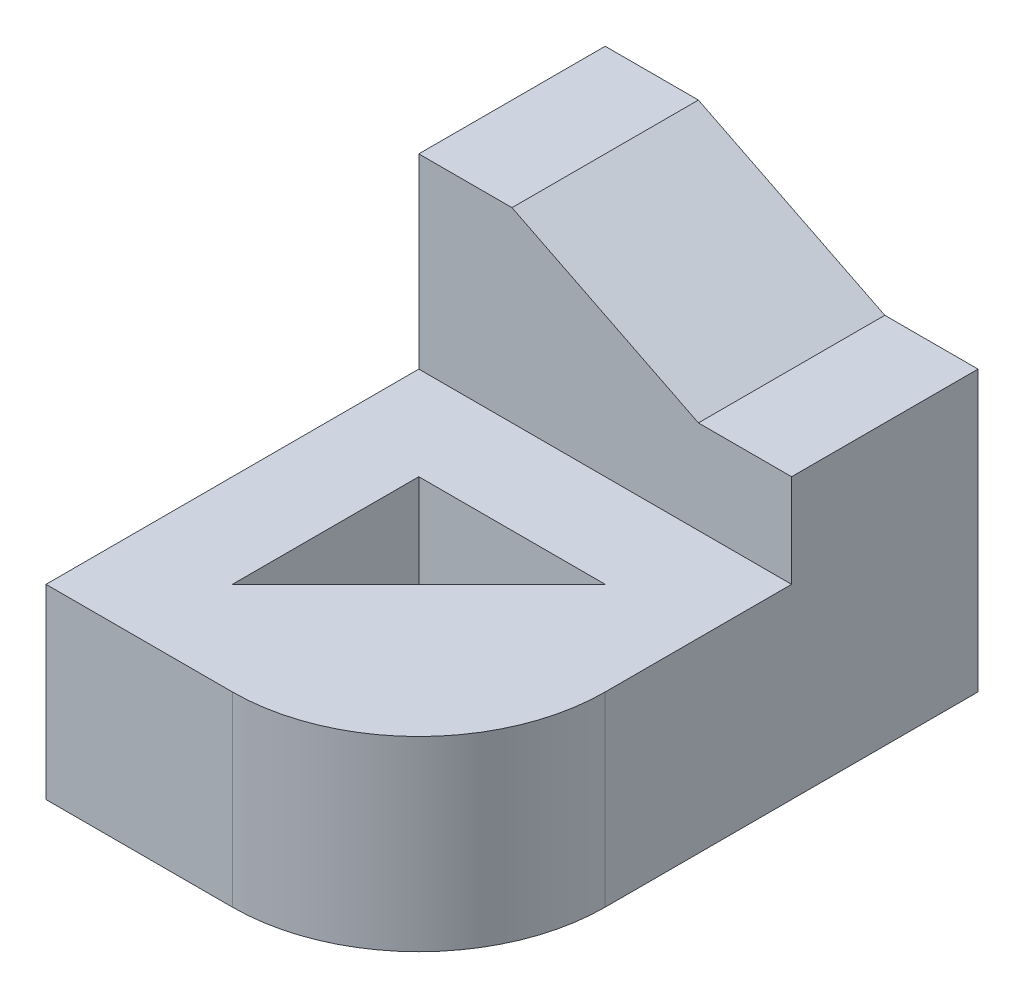
ISO-10303-21;
HEADER;
FILE_DESCRIPTION(('STEP AP214'),'2;1');
FILE_NAME('part.step','',(''),(''),'','','');
FILE_SCHEMA(('AUTOMOTIVE_DESIGN { 1 0 10303 214 1 1 1 1 }'));
ENDSEC;
DATA;
#1=APPLICATION_CONTEXT('core data for automotive mechanical design processes');
#2=APPLICATION_PROTOCOL_DEFINITION('international standard','automotive_design',2000,#1);
#3=PRODUCT_CONTEXT('',#1,'mechanical');
#4=PRODUCT('Part','Part','',(#3));
#5=PRODUCT_RELATED_PRODUCT_CATEGORY('part','',(#4));
#6=PRODUCT_DEFINITION_FORMATION('','',#4);
#7=PRODUCT_DEFINITION_CONTEXT('part definition',#1,'design');
#8=PRODUCT_DEFINITION('design','',#6,#7);
#9=PRODUCT_DEFINITION_SHAPE('','',#8);
#10=(LENGTH_UNIT() NAMED_UNIT(*) SI_UNIT(.MILLI.,.METRE.));
#11=(NAMED_UNIT(*) PLANE_ANGLE_UNIT() SI_UNIT($,.RADIAN.));
#12=(NAMED_UNIT(*) SI_UNIT($,.STERADIAN.) SOLID_ANGLE_UNIT());
#13=UNCERTAINTY_MEASURE_WITH_UNIT(LENGTH_MEASURE(1.E-05),#10,'distance_accuracy_value','');
#14=(GEOMETRIC_REPRESENTATION_CONTEXT(3) GLOBAL_UNCERTAINTY_ASSIGNED_CONTEXT((#13)) GLOBAL_UNIT_ASSIGNED_CONTEXT((#10,
#11,#12)) REPRESENTATION_CONTEXT('',''));
#15=CARTESIAN_POINT('',(0.,0.,0.));
#16=DIRECTION('',(0.,0.,1.));
#17=DIRECTION('',(1.,0.,0.));
#18=AXIS2_PLACEMENT_3D('',#15,#16,#17);
#19=CARTESIAN_POINT('',(0.,10.,0.));
#20=DIRECTION('',(1.,0.,0.));
#21=DIRECTION('',(0.,0.,-1.));
#22=AXIS2_PLACEMENT_3D('',#19,#20,#21);
#23=PLANE('',#22);
#24=DIRECTION('',(0.,0.,1.));
#25=VECTOR('',#24,1.);
#26=CARTESIAN_POINT('',(0.,0.,0.));
#27=LINE('',#26,#25);
#28=CARTESIAN_POINT('',(0.,0.,-30.));
#29=VERTEX_POINT('',#28);
#30=CARTESIAN_POINT('',(0.,0.,0.));
#31=VERTEX_POINT('',#30);
#32=EDGE_CURVE('E185',#29,#31,#27,.T.);
#33=ORIENTED_EDGE('',*,*,#32,.T.);
#34=DIRECTION('',(0.,-1.,0.));
#35=VECTOR('',#34,1.);
#36=CARTESIAN_POINT('',(0.,10.,0.));
#37=LINE('',#36,#35);
#38=CARTESIAN_POINT('',(0.,10.,0.));
#39=VERTEX_POINT('',#38);
#40=EDGE_CURVE('E209',#39,#31,#37,.T.);
#41=ORIENTED_EDGE('',*,*,#40,.F.);
#42=DIRECTION('',(0.,0.,1.));
#43=VECTOR('',#42,1.);
#44=CARTESIAN_POINT('',(0.,10.,0.));
#45=LINE('',#44,#43);
#46=CARTESIAN_POINT('',(0.,10.,-20.));
#47=VERTEX_POINT('',#46);
#48=EDGE_CURVE('E142',#47,#39,#45,.T.);
#49=ORIENTED_EDGE('',*,*,#48,.F.);
#50=DIRECTION('',(0.,1.,0.));
#51=VECTOR('',#50,1.);
#52=CARTESIAN_POINT('',(0.,10.,-20.));
#53=LINE('',#52,#51);
#54=CARTESIAN_POINT('',(0.,20.,-20.));
#55=VERTEX_POINT('',#54);
#56=EDGE_CURVE('E48',#47,#55,#53,.T.);
#57=ORIENTED_EDGE('',*,*,#56,.T.);
#58=DIRECTION('',(0.,0.,-1.));
#59=VECTOR('',#58,1.);
#60=CARTESIAN_POINT('',(0.,20.,-20.));
#61=LINE('',#60,#59);
#62=CARTESIAN_POINT('',(0.,20.,-30.));
#63=VERTEX_POINT('',#62);
#64=EDGE_CURVE('E123',#55,#63,#61,.T.);
#65=ORIENTED_EDGE('',*,*,#64,.T.);
#66=DIRECTION('',(0.,-1.,0.));
#67=VECTOR('',#66,1.);
#68=CARTESIAN_POINT('',(0.,10.,-30.));
#69=LINE('',#68,#67);
#70=EDGE_CURVE('E197',#63,#29,#69,.T.);
#71=ORIENTED_EDGE('',*,*,#70,.T.);
#72=EDGE_LOOP('',(#33,#41,#49,#57,#65,#71));
#73=FACE_BOUND('',#72,.T.);
#74=ADVANCED_FACE('F33',(#73),#23,.F.);
#75=CARTESIAN_POINT('',(0.,10.,0.));
#76=DIRECTION('',(0.,0.,-1.));
#77=DIRECTION('',(-1.,0.,0.));
#78=AXIS2_PLACEMENT_3D('',#75,#76,#77);
#79=PLANE('',#78);
#80=DIRECTION('',(1.,0.,0.));
#81=VECTOR('',#80,1.);
#82=CARTESIAN_POINT('',(0.,0.,0.));
#83=LINE('',#82,#81);
#84=CARTESIAN_POINT('',(10.,0.,0.));
#85=VERTEX_POINT('',#84);
#86=EDGE_CURVE('E199',#31,#85,#83,.T.);
#87=ORIENTED_EDGE('',*,*,#86,.T.);
#88=DIRECTION('',(0.,-1.,0.));
#89=VECTOR('',#88,1.);
#90=CARTESIAN_POINT('',(10.,10.,0.));
#91=LINE('',#90,#89);
#92=CARTESIAN_POINT('',(10.,10.,0.));
#93=VERTEX_POINT('',#92);
#94=EDGE_CURVE('E41',#85,#93,#91,.F.);
#95=ORIENTED_EDGE('',*,*,#94,.T.);
#96=DIRECTION('',(1.,0.,0.));
#97=VECTOR('',#96,1.);
#98=CARTESIAN_POINT('',(0.,10.,0.));
#99=LINE('',#98,#97);
#100=EDGE_CURVE('E190',#39,#93,#99,.T.);
#101=ORIENTED_EDGE('',*,*,#100,.F.);
#102=ORIENTED_EDGE('',*,*,#40,.T.);
#103=EDGE_LOOP('',(#87,#95,#101,#102));
#104=FACE_BOUND('',#103,.T.);
#105=ADVANCED_FACE('F219',(#104),#79,.F.);
#106=CARTESIAN_POINT('',(20.,10.,0.));
#107=DIRECTION('',(-1.,0.,0.));
#108=DIRECTION('',(0.,0.,1.));
#109=AXIS2_PLACEMENT_3D('',#106,#107,#108);
#110=PLANE('',#109);
#111=DIRECTION('',(0.,0.,-1.));
#112=VECTOR('',#111,1.);
#113=CARTESIAN_POINT('',(20.,10.,0.));
#114=LINE('',#113,#112);
#115=CARTESIAN_POINT('',(20.,10.,-10.));
#116=VERTEX_POINT('',#115);
#117=CARTESIAN_POINT('',(20.,10.,-20.));
#118=VERTEX_POINT('',#117);
#119=EDGE_CURVE('E194',#116,#118,#114,.T.);
#120=ORIENTED_EDGE('',*,*,#119,.F.);
#121=DIRECTION('',(0.,-1.,0.));
#122=VECTOR('',#121,1.);
#123=CARTESIAN_POINT('',(20.,10.,-10.));
#124=LINE('',#123,#122);
#125=CARTESIAN_POINT('',(20.,0.,-10.));
#126=VERTEX_POINT('',#125);
#127=EDGE_CURVE('E212',#116,#126,#124,.T.);
#128=ORIENTED_EDGE('',*,*,#127,.T.);
#129=DIRECTION('',(0.,0.,-1.));
#130=VECTOR('',#129,1.);
#131=CARTESIAN_POINT('',(20.,0.,0.));
#132=LINE('',#131,#130);
#133=CARTESIAN_POINT('',(20.,0.,-30.));
#134=VERTEX_POINT('',#133);
#135=EDGE_CURVE('E202',#126,#134,#132,.T.);
#136=ORIENTED_EDGE('',*,*,#135,.T.);
#137=DIRECTION('',(0.,-1.,0.));
#138=VECTOR('',#137,1.);
#139=CARTESIAN_POINT('',(20.,10.,-30.));
#140=LINE('',#139,#138);
#141=CARTESIAN_POINT('',(20.,15.,-30.));
#142=VERTEX_POINT('',#141);
#143=EDGE_CURVE('E206',#142,#134,#140,.T.);
#144=ORIENTED_EDGE('',*,*,#143,.F.);
#145=DIRECTION('',(0.,0.,-1.));
#146=VECTOR('',#145,1.);
#147=CARTESIAN_POINT('',(20.,15.,-20.));
#148=LINE('',#147,#146);
#149=CARTESIAN_POINT('',(20.,15.,-20.));
#150=VERTEX_POINT('',#149);
#151=EDGE_CURVE('E160',#150,#142,#148,.T.);
#152=ORIENTED_EDGE('',*,*,#151,.F.);
#153=DIRECTION('',(0.,-1.,0.));
#154=VECTOR('',#153,1.);
#155=CARTESIAN_POINT('',(20.,15.,-20.));
#156=LINE('',#155,#154);
#157=EDGE_CURVE('E131',#150,#118,#156,.T.);
#158=ORIENTED_EDGE('',*,*,#157,.T.);
#159=EDGE_LOOP('',(#120,#128,#136,#144,#152,#158));
#160=FACE_BOUND('',#159,.T.);
#161=ADVANCED_FACE('F228',(#160),#110,.F.);
#162=CARTESIAN_POINT('',(0.,10.,-30.));
#163=DIRECTION('',(0.,0.,1.));
#164=DIRECTION('',(1.,0.,0.));
#165=AXIS2_PLACEMENT_3D('',#162,#163,#164);
#166=PLANE('',#165);
#167=DIRECTION('',(-1.,0.,0.));
#168=VECTOR('',#167,1.);
#169=CARTESIAN_POINT('',(0.,0.,-30.));
#170=LINE('',#169,#168);
#171=EDGE_CURVE('E191',#134,#29,#170,.T.);
#172=ORIENTED_EDGE('',*,*,#171,.T.);
#173=ORIENTED_EDGE('',*,*,#70,.F.);
#174=DIRECTION('',(1.,0.,0.));
#175=VECTOR('',#174,1.);
#176=CARTESIAN_POINT('',(0.,20.,-30.));
#177=LINE('',#176,#175);
#178=CARTESIAN_POINT('',(5.,20.,-30.));
#179=VERTEX_POINT('',#178);
#180=EDGE_CURVE('E127',#63,#179,#177,.T.);
#181=ORIENTED_EDGE('',*,*,#180,.T.);
#182=DIRECTION('',(0.894427190999916,-0.447213595499958,0.));
#183=VECTOR('',#182,1.);
#184=CARTESIAN_POINT('',(5.,20.,-30.));
#185=LINE('',#184,#183);
#186=CARTESIAN_POINT('',(15.,15.,-30.));
#187=VERTEX_POINT('',#186);
#188=EDGE_CURVE('E155',#179,#187,#185,.T.);
#189=ORIENTED_EDGE('',*,*,#188,.T.);
#190=DIRECTION('',(1.,0.,0.));
#191=VECTOR('',#190,1.);
#192=CARTESIAN_POINT('',(15.,15.,-30.));
#193=LINE('',#192,#191);
#194=EDGE_CURVE('E145',#187,#142,#193,.T.);
#195=ORIENTED_EDGE('',*,*,#194,.T.);
#196=ORIENTED_EDGE('',*,*,#143,.T.);
#197=EDGE_LOOP('',(#172,#173,#181,#189,#195,#196));
#198=FACE_BOUND('',#197,.T.);
#199=ADVANCED_FACE('F234',(#198),#166,.F.);
#200=CARTESIAN_POINT('',(0.,10.,0.));
#201=DIRECTION('',(0.,-1.,0.));
#202=DIRECTION('',(0.,0.,-1.));
#203=AXIS2_PLACEMENT_3D('',#200,#201,#202);
#204=PLANE('',#203);
#205=DIRECTION('',(0.707106781186548,0.,-0.707106781186547));
#206=VECTOR('',#205,1.);
#207=CARTESIAN_POINT('',(15.,10.,-15.));
#208=LINE('',#207,#206);
#209=CARTESIAN_POINT('',(5.,10.,-5.));
#210=VERTEX_POINT('',#209);
#211=CARTESIAN_POINT('',(15.,10.,-15.));
#212=VERTEX_POINT('',#211);
#213=EDGE_CURVE('E178',#210,#212,#208,.T.);
#214=ORIENTED_EDGE('',*,*,#213,.F.);
#215=DIRECTION('',(0.,0.,1.));
#216=VECTOR('',#215,1.);
#217=CARTESIAN_POINT('',(5.,10.,-5.));
#218=LINE('',#217,#216);
#219=CARTESIAN_POINT('',(5.,10.,-15.));
#220=VERTEX_POINT('',#219);
#221=EDGE_CURVE('E56',#220,#210,#218,.T.);
#222=ORIENTED_EDGE('',*,*,#221,.F.);
#223=DIRECTION('',(-1.,0.,0.));
#224=VECTOR('',#223,1.);
#225=CARTESIAN_POINT('',(5.,10.,-15.));
#226=LINE('',#225,#224);
#227=EDGE_CURVE('E170',#212,#220,#226,.T.);
#228=ORIENTED_EDGE('',*,*,#227,.F.);
#229=EDGE_LOOP('',(#214,#222,#228));
#230=FACE_BOUND('',#229,.T.);
#231=ORIENTED_EDGE('',*,*,#119,.T.);
#232=DIRECTION('',(-1.,0.,0.));
#233=VECTOR('',#232,1.);
#234=CARTESIAN_POINT('',(20.,10.,-20.));
#235=LINE('',#234,#233);
#236=EDGE_CURVE('E143',#118,#47,#235,.T.);
#237=ORIENTED_EDGE('',*,*,#236,.T.);
#238=ORIENTED_EDGE('',*,*,#48,.T.);
#239=ORIENTED_EDGE('',*,*,#100,.T.);
#240=CARTESIAN_POINT('',(10.,10.,-10.));
#241=DIRECTION('',(0.,-1.,0.));
#242=DIRECTION('',(0.,0.,-1.));
#243=AXIS2_PLACEMENT_3D('',#240,#241,#242);
#244=CIRCLE('',#243,10.);
#245=EDGE_CURVE('E11',#93,#116,#244,.F.);
#246=ORIENTED_EDGE('',*,*,#245,.T.);
#247=EDGE_LOOP('',(#231,#237,#238,#239,#246));
#248=FACE_BOUND('',#247,.T.);
#249=ADVANCED_FACE('F223',(#230,#248),#204,.F.);
#250=CARTESIAN_POINT('',(0.,0.,0.));
#251=DIRECTION('',(0.,-1.,0.));
#252=DIRECTION('',(0.,0.,-1.));
#253=AXIS2_PLACEMENT_3D('',#250,#251,#252);
#254=PLANE('',#253);
#255=DIRECTION('',(0.,0.,1.));
#256=VECTOR('',#255,1.);
#257=CARTESIAN_POINT('',(5.,0.,-5.));
#258=LINE('',#257,#256);
#259=CARTESIAN_POINT('',(5.,0.,-15.));
#260=VERTEX_POINT('',#259);
#261=CARTESIAN_POINT('',(5.,0.,-5.));
#262=VERTEX_POINT('',#261);
#263=EDGE_CURVE('E166',#260,#262,#258,.T.);
#264=ORIENTED_EDGE('',*,*,#263,.T.);
#265=DIRECTION('',(0.707106781186548,0.,-0.707106781186547));
#266=VECTOR('',#265,1.);
#267=CARTESIAN_POINT('',(15.,0.,-15.));
#268=LINE('',#267,#266);
#269=CARTESIAN_POINT('',(15.,0.,-15.));
#270=VERTEX_POINT('',#269);
#271=EDGE_CURVE('E169',#262,#270,#268,.T.);
#272=ORIENTED_EDGE('',*,*,#271,.T.);
#273=DIRECTION('',(-1.,0.,0.));
#274=VECTOR('',#273,1.);
#275=CARTESIAN_POINT('',(5.,0.,-15.));
#276=LINE('',#275,#274);
#277=EDGE_CURVE('E173',#270,#260,#276,.T.);
#278=ORIENTED_EDGE('',*,*,#277,.T.);
#279=EDGE_LOOP('',(#264,#272,#278));
#280=FACE_BOUND('',#279,.T.);
#281=ORIENTED_EDGE('',*,*,#135,.F.);
#282=CARTESIAN_POINT('',(10.,0.,-10.));
#283=DIRECTION('',(0.,-1.,0.));
#284=DIRECTION('',(0.,0.,-1.));
#285=AXIS2_PLACEMENT_3D('',#282,#283,#284);
#286=CIRCLE('',#285,10.);
#287=EDGE_CURVE('E215',#126,#85,#286,.T.);
#288=ORIENTED_EDGE('',*,*,#287,.T.);
#289=ORIENTED_EDGE('',*,*,#86,.F.);
#290=ORIENTED_EDGE('',*,*,#32,.F.);
#291=ORIENTED_EDGE('',*,*,#171,.F.);
#292=EDGE_LOOP('',(#281,#288,#289,#290,#291));
#293=FACE_BOUND('',#292,.T.);
#294=ADVANCED_FACE('F231',(#280,#293),#254,.T.);
#295=CARTESIAN_POINT('',(10.,10.,-10.));
#296=DIRECTION('',(0.,-1.,0.));
#297=DIRECTION('',(0.,0.,-1.));
#298=AXIS2_PLACEMENT_3D('',#295,#296,#297);
#299=CYLINDRICAL_SURFACE('',#298,10.);
#300=ORIENTED_EDGE('',*,*,#245,.F.);
#301=ORIENTED_EDGE('',*,*,#94,.F.);
#302=ORIENTED_EDGE('',*,*,#287,.F.);
#303=ORIENTED_EDGE('',*,*,#127,.F.);
#304=EDGE_LOOP('',(#300,#301,#302,#303));
#305=FACE_BOUND('',#304,.T.);
#306=ADVANCED_FACE('F35',(#305),#299,.T.);
#307=CARTESIAN_POINT('',(5.,0.,-5.));
#308=DIRECTION('',(-1.,0.,0.));
#309=DIRECTION('',(0.,0.,1.));
#310=AXIS2_PLACEMENT_3D('',#307,#308,#309);
#311=PLANE('',#310);
#312=ORIENTED_EDGE('',*,*,#221,.T.);
#313=DIRECTION('',(0.,1.,0.));
#314=VECTOR('',#313,1.);
#315=CARTESIAN_POINT('',(5.,0.,-5.));
#316=LINE('',#315,#314);
#317=EDGE_CURVE('E176',#262,#210,#316,.T.);
#318=ORIENTED_EDGE('',*,*,#317,.F.);
#319=ORIENTED_EDGE('',*,*,#263,.F.);
#320=DIRECTION('',(0.,1.,0.));
#321=VECTOR('',#320,1.);
#322=CARTESIAN_POINT('',(5.,0.,-15.));
#323=LINE('',#322,#321);
#324=EDGE_CURVE('E183',#260,#220,#323,.T.);
#325=ORIENTED_EDGE('',*,*,#324,.T.);
#326=EDGE_LOOP('',(#312,#318,#319,#325));
#327=FACE_BOUND('',#326,.T.);
#328=ADVANCED_FACE('F267',(#327),#311,.F.);
#329=CARTESIAN_POINT('',(5.,0.,-15.));
#330=DIRECTION('',(0.,0.,-1.));
#331=DIRECTION('',(-1.,0.,0.));
#332=AXIS2_PLACEMENT_3D('',#329,#330,#331);
#333=PLANE('',#332);
#334=ORIENTED_EDGE('',*,*,#227,.T.);
#335=ORIENTED_EDGE('',*,*,#324,.F.);
#336=ORIENTED_EDGE('',*,*,#277,.F.);
#337=DIRECTION('',(0.,1.,0.));
#338=VECTOR('',#337,1.);
#339=CARTESIAN_POINT('',(15.,0.,-15.));
#340=LINE('',#339,#338);
#341=EDGE_CURVE('E186',#270,#212,#340,.T.);
#342=ORIENTED_EDGE('',*,*,#341,.T.);
#343=EDGE_LOOP('',(#334,#335,#336,#342));
#344=FACE_BOUND('',#343,.T.);
#345=ADVANCED_FACE('F270',(#344),#333,.F.);
#346=CARTESIAN_POINT('',(15.,0.,-15.));
#347=DIRECTION('',(0.707106781186547,0.,0.707106781186548));
#348=DIRECTION('',(0.707106781186548,0.,-0.707106781186547));
#349=AXIS2_PLACEMENT_3D('',#346,#347,#348);
#350=PLANE('',#349);
#351=ORIENTED_EDGE('',*,*,#213,.T.);
#352=ORIENTED_EDGE('',*,*,#341,.F.);
#353=ORIENTED_EDGE('',*,*,#271,.F.);
#354=ORIENTED_EDGE('',*,*,#317,.T.);
#355=EDGE_LOOP('',(#351,#352,#353,#354));
#356=FACE_BOUND('',#355,.T.);
#357=ADVANCED_FACE('F249',(#356),#350,.F.);
#358=CARTESIAN_POINT('',(15.,15.,-20.));
#359=DIRECTION('',(0.,1.,0.));
#360=DIRECTION('',(0.,0.,1.));
#361=AXIS2_PLACEMENT_3D('',#358,#359,#360);
#362=PLANE('',#361);
#363=ORIENTED_EDGE('',*,*,#194,.F.);
#364=DIRECTION('',(0.,0.,-1.));
#365=VECTOR('',#364,1.);
#366=CARTESIAN_POINT('',(15.,15.,-20.));
#367=LINE('',#366,#365);
#368=CARTESIAN_POINT('',(15.,15.,-20.));
#369=VERTEX_POINT('',#368);
#370=EDGE_CURVE('E163',#369,#187,#367,.T.);
#371=ORIENTED_EDGE('',*,*,#370,.F.);
#372=DIRECTION('',(1.,0.,0.));
#373=VECTOR('',#372,1.);
#374=CARTESIAN_POINT('',(15.,15.,-20.));
#375=LINE('',#374,#373);
#376=EDGE_CURVE('E149',#369,#150,#375,.T.);
#377=ORIENTED_EDGE('',*,*,#376,.T.);
#378=ORIENTED_EDGE('',*,*,#151,.T.);
#379=EDGE_LOOP('',(#363,#371,#377,#378));
#380=FACE_BOUND('',#379,.T.);
#381=ADVANCED_FACE('F237',(#380),#362,.T.);
#382=CARTESIAN_POINT('',(5.,20.,-20.));
#383=DIRECTION('',(0.447213595499958,0.894427190999916,0.));
#384=DIRECTION('',(-0.894427190999916,0.447213595499958,0.));
#385=AXIS2_PLACEMENT_3D('',#382,#383,#384);
#386=PLANE('',#385);
#387=ORIENTED_EDGE('',*,*,#188,.F.);
#388=DIRECTION('',(0.,0.,-1.));
#389=VECTOR('',#388,1.);
#390=CARTESIAN_POINT('',(5.,20.,-20.));
#391=LINE('',#390,#389);
#392=CARTESIAN_POINT('',(5.,20.,-20.));
#393=VERTEX_POINT('',#392);
#394=EDGE_CURVE('E130',#393,#179,#391,.T.);
#395=ORIENTED_EDGE('',*,*,#394,.F.);
#396=DIRECTION('',(0.894427190999916,-0.447213595499958,0.));
#397=VECTOR('',#396,1.);
#398=CARTESIAN_POINT('',(5.,20.,-20.));
#399=LINE('',#398,#397);
#400=EDGE_CURVE('E137',#393,#369,#399,.T.);
#401=ORIENTED_EDGE('',*,*,#400,.T.);
#402=ORIENTED_EDGE('',*,*,#370,.T.);
#403=EDGE_LOOP('',(#387,#395,#401,#402));
#404=FACE_BOUND('',#403,.T.);
#405=ADVANCED_FACE('F241',(#404),#386,.T.);
#406=CARTESIAN_POINT('',(0.,20.,-20.));
#407=DIRECTION('',(0.,1.,0.));
#408=DIRECTION('',(0.,0.,1.));
#409=AXIS2_PLACEMENT_3D('',#406,#407,#408);
#410=PLANE('',#409);
#411=ORIENTED_EDGE('',*,*,#180,.F.);
#412=ORIENTED_EDGE('',*,*,#64,.F.);
#413=DIRECTION('',(1.,0.,0.));
#414=VECTOR('',#413,1.);
#415=CARTESIAN_POINT('',(0.,20.,-20.));
#416=LINE('',#415,#414);
#417=EDGE_CURVE('E125',#55,#393,#416,.T.);
#418=ORIENTED_EDGE('',*,*,#417,.T.);
#419=ORIENTED_EDGE('',*,*,#394,.T.);
#420=EDGE_LOOP('',(#411,#412,#418,#419));
#421=FACE_BOUND('',#420,.T.);
#422=ADVANCED_FACE('F124',(#421),#410,.T.);
#423=CARTESIAN_POINT('',(0.,0.,-20.));
#424=DIRECTION('',(0.,0.,-1.));
#425=DIRECTION('',(-1.,0.,0.));
#426=AXIS2_PLACEMENT_3D('',#423,#424,#425);
#427=PLANE('',#426);
#428=ORIENTED_EDGE('',*,*,#236,.F.);
#429=ORIENTED_EDGE('',*,*,#157,.F.);
#430=ORIENTED_EDGE('',*,*,#376,.F.);
#431=ORIENTED_EDGE('',*,*,#400,.F.);
#432=ORIENTED_EDGE('',*,*,#417,.F.);
#433=ORIENTED_EDGE('',*,*,#56,.F.);
#434=EDGE_LOOP('',(#428,#429,#430,#431,#432,#433));
#435=FACE_BOUND('',#434,.T.);
#436=ADVANCED_FACE('F134',(#435),#427,.F.);
#437=CLOSED_SHELL('',(#74,#105,#161,#199,#249,#294,#306,#328,#345,#357,#381,#405,#422,#436));
#438=MANIFOLD_SOLID_BREP('B2',#437);
#439=ADVANCED_BREP_SHAPE_REPRESENTATION('',(#18,#438),#14);
#440=SHAPE_DEFINITION_REPRESENTATION(#9,#439);
ENDSEC;
END-ISO-10303-21;
